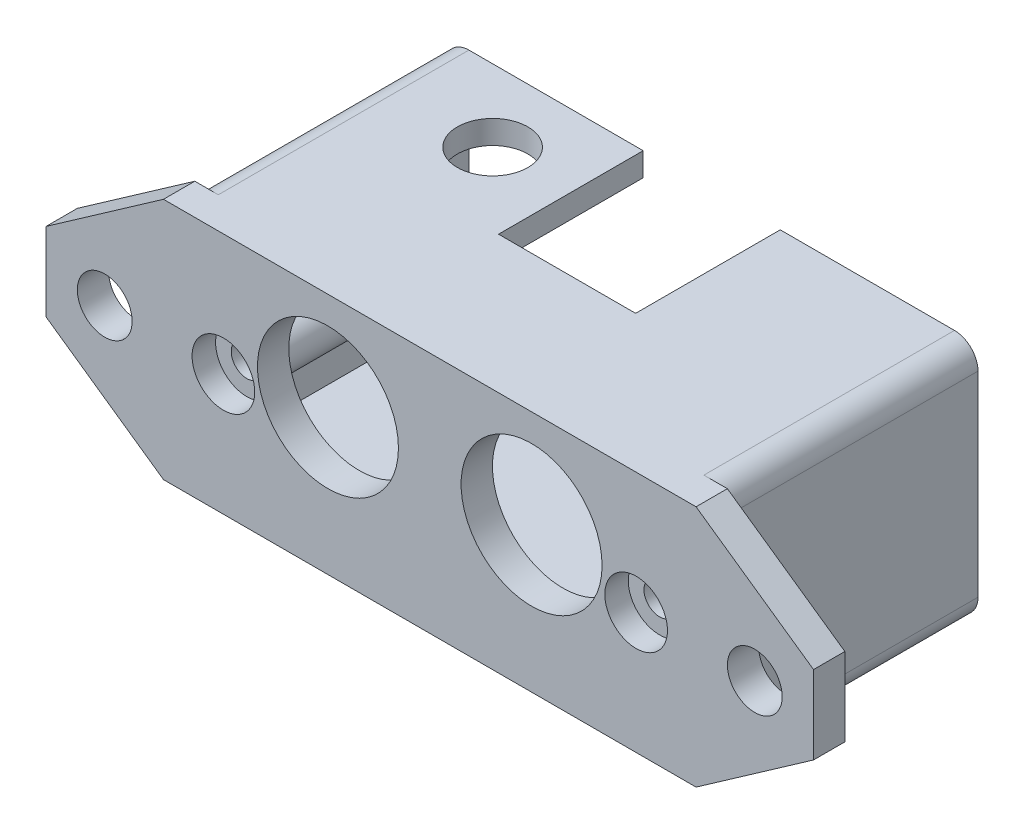
ISO-10303-21;
HEADER;
FILE_DESCRIPTION(('STEP AP214'),'2;1');
FILE_NAME('part.step','',(''),(''),'','','');
FILE_SCHEMA(('AUTOMOTIVE_DESIGN { 1 0 10303 214 1 1 1 1 }'));
ENDSEC;
DATA;
#1=APPLICATION_CONTEXT('core data for automotive mechanical design processes');
#2=APPLICATION_PROTOCOL_DEFINITION('international standard','automotive_design',2000,#1);
#3=PRODUCT_CONTEXT('',#1,'mechanical');
#4=PRODUCT('Part','Part','',(#3));
#5=PRODUCT_RELATED_PRODUCT_CATEGORY('part','',(#4));
#6=PRODUCT_DEFINITION_FORMATION('','',#4);
#7=PRODUCT_DEFINITION_CONTEXT('part definition',#1,'design');
#8=PRODUCT_DEFINITION('design','',#6,#7);
#9=PRODUCT_DEFINITION_SHAPE('','',#8);
#10=(LENGTH_UNIT() NAMED_UNIT(*) SI_UNIT(.MILLI.,.METRE.));
#11=(NAMED_UNIT(*) PLANE_ANGLE_UNIT() SI_UNIT($,.RADIAN.));
#12=(NAMED_UNIT(*) SI_UNIT($,.STERADIAN.) SOLID_ANGLE_UNIT());
#13=UNCERTAINTY_MEASURE_WITH_UNIT(LENGTH_MEASURE(1.E-05),#10,'distance_accuracy_value','');
#14=(GEOMETRIC_REPRESENTATION_CONTEXT(3) GLOBAL_UNCERTAINTY_ASSIGNED_CONTEXT((#13)) GLOBAL_UNIT_ASSIGNED_CONTEXT((#10,
#11,#12)) REPRESENTATION_CONTEXT('',''));
#15=CARTESIAN_POINT('',(0.,0.,0.));
#16=DIRECTION('',(0.,0.,1.));
#17=DIRECTION('',(1.,0.,0.));
#18=AXIS2_PLACEMENT_3D('',#15,#16,#17);
#19=CARTESIAN_POINT('',(-26.35,0.,4.));
#20=DIRECTION('',(0.,0.,-1.));
#21=DIRECTION('',(-1.,0.,0.));
#22=AXIS2_PLACEMENT_3D('',#19,#20,#21);
#23=CYLINDRICAL_SURFACE('',#22,2.);
#24=CARTESIAN_POINT('',(-26.35,0.,-12.));
#25=DIRECTION('',(0.,0.,1.));
#26=DIRECTION('',(1.,0.,0.));
#27=AXIS2_PLACEMENT_3D('',#24,#25,#26);
#28=CIRCLE('',#27,2.);
#29=CARTESIAN_POINT('',(-24.35,0.,-12.));
#30=VERTEX_POINT('',#29);
#31=EDGE_CURVE('E303',#30,#30,#28,.T.);
#32=ORIENTED_EDGE('',*,*,#31,.F.);
#33=EDGE_LOOP('',(#32));
#34=FACE_BOUND('',#33,.T.);
#35=CARTESIAN_POINT('',(-26.35,0.,1.));
#36=DIRECTION('',(0.,0.,1.));
#37=DIRECTION('',(1.,0.,0.));
#38=AXIS2_PLACEMENT_3D('',#35,#36,#37);
#39=CIRCLE('',#38,2.);
#40=CARTESIAN_POINT('',(-24.35,0.,1.));
#41=VERTEX_POINT('',#40);
#42=EDGE_CURVE('E946',#41,#41,#39,.T.);
#43=ORIENTED_EDGE('',*,*,#42,.T.);
#44=EDGE_LOOP('',(#43));
#45=FACE_BOUND('',#44,.T.);
#46=ADVANCED_FACE('F34',(#34,#45),#23,.F.);
#47=CARTESIAN_POINT('',(26.35,0.,4.));
#48=DIRECTION('',(0.,0.,-1.));
#49=DIRECTION('',(-1.,0.,0.));
#50=AXIS2_PLACEMENT_3D('',#47,#48,#49);
#51=CYLINDRICAL_SURFACE('',#50,2.);
#52=CARTESIAN_POINT('',(26.35,0.,-12.));
#53=DIRECTION('',(0.,0.,1.));
#54=DIRECTION('',(1.,0.,0.));
#55=AXIS2_PLACEMENT_3D('',#52,#53,#54);
#56=CIRCLE('',#55,2.);
#57=CARTESIAN_POINT('',(28.35,0.,-12.));
#58=VERTEX_POINT('',#57);
#59=EDGE_CURVE('E323',#58,#58,#56,.T.);
#60=ORIENTED_EDGE('',*,*,#59,.F.);
#61=EDGE_LOOP('',(#60));
#62=FACE_BOUND('',#61,.T.);
#63=CARTESIAN_POINT('',(26.35,0.,1.));
#64=DIRECTION('',(0.,0.,1.));
#65=DIRECTION('',(1.,0.,0.));
#66=AXIS2_PLACEMENT_3D('',#63,#64,#65);
#67=CIRCLE('',#66,2.);
#68=CARTESIAN_POINT('',(28.35,0.,1.));
#69=VERTEX_POINT('',#68);
#70=EDGE_CURVE('E937',#69,#69,#67,.T.);
#71=ORIENTED_EDGE('',*,*,#70,.T.);
#72=EDGE_LOOP('',(#71));
#73=FACE_BOUND('',#72,.T.);
#74=ADVANCED_FACE('F515',(#62,#73),#51,.F.);
#75=CARTESIAN_POINT('',(-34.,15.5,4.));
#76=DIRECTION('',(0.,-1.,0.));
#77=DIRECTION('',(1.,0.,0.));
#78=AXIS2_PLACEMENT_3D('',#75,#76,#77);
#79=PLANE('',#78);
#80=CARTESIAN_POINT('',(-18.75,15.5,-22.7736833205407));
#81=DIRECTION('',(0.,-1.,0.));
#82=DIRECTION('',(1.,0.,0.));
#83=AXIS2_PLACEMENT_3D('',#80,#81,#82);
#84=CIRCLE('',#83,4.5);
#85=CARTESIAN_POINT('',(-14.25,15.5,-22.7736833205407));
#86=VERTEX_POINT('',#85);
#87=EDGE_CURVE('E927',#86,#86,#84,.F.);
#88=ORIENTED_EDGE('',*,*,#87,.F.);
#89=EDGE_LOOP('',(#88));
#90=FACE_BOUND('',#89,.T.);
#91=DIRECTION('',(0.,0.,-1.));
#92=VECTOR('',#91,1.);
#93=CARTESIAN_POINT('',(8.75000000000001,15.5,3.99999999999999));
#94=LINE('',#93,#92);
#95=CARTESIAN_POINT('',(8.75,15.5,-13.5324195221433));
#96=VERTEX_POINT('',#95);
#97=CARTESIAN_POINT('',(8.75,15.5,-32.));
#98=VERTEX_POINT('',#97);
#99=EDGE_CURVE('E215',#96,#98,#94,.T.);
#100=ORIENTED_EDGE('',*,*,#99,.F.);
#101=DIRECTION('',(1.,0.,0.));
#102=VECTOR('',#101,1.);
#103=CARTESIAN_POINT('',(-34.,15.5,-13.5324195221433));
#104=LINE('',#103,#102);
#105=CARTESIAN_POINT('',(-8.75,15.5,-13.5324195221433));
#106=VERTEX_POINT('',#105);
#107=EDGE_CURVE('E208',#106,#96,#104,.T.);
#108=ORIENTED_EDGE('',*,*,#107,.F.);
#109=DIRECTION('',(0.,0.,1.));
#110=VECTOR('',#109,1.);
#111=CARTESIAN_POINT('',(-8.75,15.5,4.));
#112=LINE('',#111,#110);
#113=CARTESIAN_POINT('',(-8.75,15.5,-32.));
#114=VERTEX_POINT('',#113);
#115=EDGE_CURVE('E195',#114,#106,#112,.T.);
#116=ORIENTED_EDGE('',*,*,#115,.F.);
#117=DIRECTION('',(-1.,0.,0.));
#118=VECTOR('',#117,1.);
#119=CARTESIAN_POINT('',(31.,15.5,-32.));
#120=LINE('',#119,#118);
#121=CARTESIAN_POINT('',(-31.,15.5,-32.));
#122=VERTEX_POINT('',#121);
#123=EDGE_CURVE('E280',#114,#122,#120,.T.);
#124=ORIENTED_EDGE('',*,*,#123,.T.);
#125=DIRECTION('',(0.,0.,1.));
#126=VECTOR('',#125,1.);
#127=CARTESIAN_POINT('',(-31.,15.5,-32.));
#128=LINE('',#127,#126);
#129=CARTESIAN_POINT('',(-31.,15.5,0.));
#130=VERTEX_POINT('',#129);
#131=EDGE_CURVE('E300',#122,#130,#128,.T.);
#132=ORIENTED_EDGE('',*,*,#131,.T.);
#133=DIRECTION('',(-1.,0.,0.));
#134=VECTOR('',#133,1.);
#135=CARTESIAN_POINT('',(-34.,15.5,0.));
#136=LINE('',#135,#134);
#137=CARTESIAN_POINT('',(-34.,15.5,0.));
#138=VERTEX_POINT('',#137);
#139=EDGE_CURVE('E394',#130,#138,#136,.T.);
#140=ORIENTED_EDGE('',*,*,#139,.T.);
#141=DIRECTION('',(0.,0.,-1.));
#142=VECTOR('',#141,1.);
#143=CARTESIAN_POINT('',(-34.,15.5,4.));
#144=LINE('',#143,#142);
#145=CARTESIAN_POINT('',(-34.,15.5,4.));
#146=VERTEX_POINT('',#145);
#147=EDGE_CURVE('E377',#146,#138,#144,.T.);
#148=ORIENTED_EDGE('',*,*,#147,.F.);
#149=DIRECTION('',(-1.,0.,0.));
#150=VECTOR('',#149,1.);
#151=CARTESIAN_POINT('',(-34.,15.5,4.));
#152=LINE('',#151,#150);
#153=CARTESIAN_POINT('',(34.,15.5,4.));
#154=VERTEX_POINT('',#153);
#155=EDGE_CURVE('E375',#154,#146,#152,.T.);
#156=ORIENTED_EDGE('',*,*,#155,.F.);
#157=DIRECTION('',(0.,0.,-1.));
#158=VECTOR('',#157,1.);
#159=CARTESIAN_POINT('',(34.,15.5,4.));
#160=LINE('',#159,#158);
#161=CARTESIAN_POINT('',(34.,15.5,0.));
#162=VERTEX_POINT('',#161);
#163=EDGE_CURVE('E399',#154,#162,#160,.T.);
#164=ORIENTED_EDGE('',*,*,#163,.T.);
#165=CARTESIAN_POINT('',(31.,15.5,0.));
#166=VERTEX_POINT('',#165);
#167=EDGE_CURVE('E363',#162,#166,#136,.T.);
#168=ORIENTED_EDGE('',*,*,#167,.T.);
#169=DIRECTION('',(0.,0.,1.));
#170=VECTOR('',#169,1.);
#171=CARTESIAN_POINT('',(31.,15.5,-32.));
#172=LINE('',#171,#170);
#173=CARTESIAN_POINT('',(31.,15.5,-32.));
#174=VERTEX_POINT('',#173);
#175=EDGE_CURVE('E304',#174,#166,#172,.T.);
#176=ORIENTED_EDGE('',*,*,#175,.F.);
#177=EDGE_CURVE('E281',#174,#98,#120,.T.);
#178=ORIENTED_EDGE('',*,*,#177,.T.);
#179=EDGE_LOOP('',(#100,#108,#116,#124,#132,#140,#148,#156,#164,#168,#176,#178));
#180=FACE_BOUND('',#179,.T.);
#181=ADVANCED_FACE('F213',(#90,#180),#79,.F.);
#182=CARTESIAN_POINT('',(-31.,12.5,-32.));
#183=DIRECTION('',(0.,0.,-1.));
#184=DIRECTION('',(-1.,0.,0.));
#185=AXIS2_PLACEMENT_3D('',#182,#183,#184);
#186=PLANE('',#185);
#187=DIRECTION('',(-1.,0.,0.));
#188=VECTOR('',#187,1.);
#189=CARTESIAN_POINT('',(-31.,12.5,-32.));
#190=LINE('',#189,#188);
#191=CARTESIAN_POINT('',(31.,12.5,-32.));
#192=VERTEX_POINT('',#191);
#193=CARTESIAN_POINT('',(8.75,12.5,-32.));
#194=VERTEX_POINT('',#193);
#195=EDGE_CURVE('E223',#192,#194,#190,.T.);
#196=ORIENTED_EDGE('',*,*,#195,.T.);
#197=DIRECTION('',(0.,1.,0.));
#198=VECTOR('',#197,1.);
#199=CARTESIAN_POINT('',(8.75,12.5,-32.));
#200=LINE('',#199,#198);
#201=EDGE_CURVE('E205',#194,#98,#200,.T.);
#202=ORIENTED_EDGE('',*,*,#201,.T.);
#203=ORIENTED_EDGE('',*,*,#177,.F.);
#204=CARTESIAN_POINT('',(31.,12.5,-32.));
#205=DIRECTION('',(0.,0.,1.));
#206=DIRECTION('',(1.,0.,0.));
#207=AXIS2_PLACEMENT_3D('',#204,#205,#206);
#208=CIRCLE('',#207,3.);
#209=CARTESIAN_POINT('',(34.,12.5,-32.));
#210=VERTEX_POINT('',#209);
#211=EDGE_CURVE('E277',#210,#174,#208,.T.);
#212=ORIENTED_EDGE('',*,*,#211,.F.);
#213=DIRECTION('',(0.,1.,0.));
#214=VECTOR('',#213,1.);
#215=CARTESIAN_POINT('',(34.,12.5,-32.));
#216=LINE('',#215,#214);
#217=CARTESIAN_POINT('',(34.,-12.5,-32.));
#218=VERTEX_POINT('',#217);
#219=EDGE_CURVE('E274',#218,#210,#216,.T.);
#220=ORIENTED_EDGE('',*,*,#219,.F.);
#221=CARTESIAN_POINT('',(31.,-12.5,-32.));
#222=DIRECTION('',(0.,0.,1.));
#223=DIRECTION('',(1.,0.,0.));
#224=AXIS2_PLACEMENT_3D('',#221,#222,#223);
#225=CIRCLE('',#224,3.);
#226=CARTESIAN_POINT('',(31.,-15.5,-32.));
#227=VERTEX_POINT('',#226);
#228=EDGE_CURVE('E271',#227,#218,#225,.T.);
#229=ORIENTED_EDGE('',*,*,#228,.F.);
#230=DIRECTION('',(1.,0.,0.));
#231=VECTOR('',#230,1.);
#232=CARTESIAN_POINT('',(31.,-15.5,-32.));
#233=LINE('',#232,#231);
#234=CARTESIAN_POINT('',(-31.,-15.5,-32.));
#235=VERTEX_POINT('',#234);
#236=EDGE_CURVE('E268',#235,#227,#233,.T.);
#237=ORIENTED_EDGE('',*,*,#236,.F.);
#238=CARTESIAN_POINT('',(-31.,-12.5,-32.));
#239=DIRECTION('',(0.,0.,1.));
#240=DIRECTION('',(1.,0.,0.));
#241=AXIS2_PLACEMENT_3D('',#238,#239,#240);
#242=CIRCLE('',#241,3.);
#243=CARTESIAN_POINT('',(-34.,-12.5,-32.));
#244=VERTEX_POINT('',#243);
#245=EDGE_CURVE('E265',#244,#235,#242,.T.);
#246=ORIENTED_EDGE('',*,*,#245,.F.);
#247=DIRECTION('',(0.,-1.,0.));
#248=VECTOR('',#247,1.);
#249=CARTESIAN_POINT('',(-34.,12.5,-32.));
#250=LINE('',#249,#248);
#251=CARTESIAN_POINT('',(-34.,12.5,-32.));
#252=VERTEX_POINT('',#251);
#253=EDGE_CURVE('E261',#252,#244,#250,.T.);
#254=ORIENTED_EDGE('',*,*,#253,.F.);
#255=CARTESIAN_POINT('',(-31.,12.5,-32.));
#256=DIRECTION('',(0.,0.,1.));
#257=DIRECTION('',(-1.,0.,0.));
#258=AXIS2_PLACEMENT_3D('',#255,#256,#257);
#259=CIRCLE('',#258,3.);
#260=EDGE_CURVE('E258',#122,#252,#259,.T.);
#261=ORIENTED_EDGE('',*,*,#260,.F.);
#262=ORIENTED_EDGE('',*,*,#123,.F.);
#263=DIRECTION('',(0.,-1.,0.));
#264=VECTOR('',#263,1.);
#265=CARTESIAN_POINT('',(-8.75,12.5,-32.));
#266=LINE('',#265,#264);
#267=CARTESIAN_POINT('',(-8.75,12.5,-32.));
#268=VERTEX_POINT('',#267);
#269=EDGE_CURVE('E201',#114,#268,#266,.T.);
#270=ORIENTED_EDGE('',*,*,#269,.T.);
#271=CARTESIAN_POINT('',(-31.,12.5,-32.));
#272=VERTEX_POINT('',#271);
#273=EDGE_CURVE('E227',#268,#272,#190,.T.);
#274=ORIENTED_EDGE('',*,*,#273,.T.);
#275=DIRECTION('',(0.,-1.,0.));
#276=VECTOR('',#275,1.);
#277=CARTESIAN_POINT('',(-31.,12.5,-32.));
#278=LINE('',#277,#276);
#279=CARTESIAN_POINT('',(-31.,-12.5,-32.));
#280=VERTEX_POINT('',#279);
#281=EDGE_CURVE('E226',#272,#280,#278,.T.);
#282=ORIENTED_EDGE('',*,*,#281,.T.);
#283=DIRECTION('',(1.,0.,0.));
#284=VECTOR('',#283,1.);
#285=CARTESIAN_POINT('',(31.,-12.5,-32.));
#286=LINE('',#285,#284);
#287=CARTESIAN_POINT('',(31.,-12.5,-32.));
#288=VERTEX_POINT('',#287);
#289=EDGE_CURVE('E230',#280,#288,#286,.T.);
#290=ORIENTED_EDGE('',*,*,#289,.T.);
#291=DIRECTION('',(0.,1.,0.));
#292=VECTOR('',#291,1.);
#293=CARTESIAN_POINT('',(31.,12.5,-32.));
#294=LINE('',#293,#292);
#295=EDGE_CURVE('E233',#288,#192,#294,.T.);
#296=ORIENTED_EDGE('',*,*,#295,.T.);
#297=EDGE_LOOP('',(#196,#202,#203,#212,#220,#229,#237,#246,#254,#261,#262,#270,#274,#282,#290,#296));
#298=FACE_BOUND('',#297,.T.);
#299=ADVANCED_FACE('F424',(#298),#186,.T.);
#300=CARTESIAN_POINT('',(-31.,12.5,-32.));
#301=DIRECTION('',(0.,1.,0.));
#302=DIRECTION('',(0.,0.,1.));
#303=AXIS2_PLACEMENT_3D('',#300,#301,#302);
#304=PLANE('',#303);
#305=CARTESIAN_POINT('',(-18.75,12.5,-22.7736833205407));
#306=DIRECTION('',(0.,1.,0.));
#307=DIRECTION('',(0.,0.,1.));
#308=AXIS2_PLACEMENT_3D('',#305,#306,#307);
#309=CIRCLE('',#308,4.5);
#310=CARTESIAN_POINT('',(-18.75,12.5,-18.2736833205407));
#311=VERTEX_POINT('',#310);
#312=EDGE_CURVE('E38',#311,#311,#309,.F.);
#313=ORIENTED_EDGE('',*,*,#312,.F.);
#314=EDGE_LOOP('',(#313));
#315=FACE_BOUND('',#314,.T.);
#316=DIRECTION('',(0.,0.,1.));
#317=VECTOR('',#316,1.);
#318=CARTESIAN_POINT('',(8.75,12.5,-32.));
#319=LINE('',#318,#317);
#320=CARTESIAN_POINT('',(8.75,12.5,-13.5324195221433));
#321=VERTEX_POINT('',#320);
#322=EDGE_CURVE('E11',#194,#321,#319,.T.);
#323=ORIENTED_EDGE('',*,*,#322,.F.);
#324=ORIENTED_EDGE('',*,*,#195,.F.);
#325=DIRECTION('',(0.,0.,1.));
#326=VECTOR('',#325,1.);
#327=CARTESIAN_POINT('',(31.,12.5,-32.));
#328=LINE('',#327,#326);
#329=CARTESIAN_POINT('',(31.,12.5,0.));
#330=VERTEX_POINT('',#329);
#331=EDGE_CURVE('E247',#192,#330,#328,.T.);
#332=ORIENTED_EDGE('',*,*,#331,.T.);
#333=DIRECTION('',(-1.,0.,0.));
#334=VECTOR('',#333,1.);
#335=CARTESIAN_POINT('',(-31.,12.5,0.));
#336=LINE('',#335,#334);
#337=CARTESIAN_POINT('',(-31.,12.5,0.));
#338=VERTEX_POINT('',#337);
#339=EDGE_CURVE('E57',#330,#338,#336,.T.);
#340=ORIENTED_EDGE('',*,*,#339,.T.);
#341=DIRECTION('',(0.,0.,1.));
#342=VECTOR('',#341,1.);
#343=CARTESIAN_POINT('',(-31.,12.5,-32.));
#344=LINE('',#343,#342);
#345=EDGE_CURVE('E236',#272,#338,#344,.T.);
#346=ORIENTED_EDGE('',*,*,#345,.F.);
#347=ORIENTED_EDGE('',*,*,#273,.F.);
#348=DIRECTION('',(0.,0.,-1.));
#349=VECTOR('',#348,1.);
#350=CARTESIAN_POINT('',(-8.75,12.5,-32.));
#351=LINE('',#350,#349);
#352=CARTESIAN_POINT('',(-8.75,12.5,-13.5324195221433));
#353=VERTEX_POINT('',#352);
#354=EDGE_CURVE('E43',#353,#268,#351,.T.);
#355=ORIENTED_EDGE('',*,*,#354,.F.);
#356=DIRECTION('',(-1.,0.,0.));
#357=VECTOR('',#356,1.);
#358=CARTESIAN_POINT('',(-31.,12.5,-13.5324195221433));
#359=LINE('',#358,#357);
#360=EDGE_CURVE('E210',#321,#353,#359,.T.);
#361=ORIENTED_EDGE('',*,*,#360,.F.);
#362=EDGE_LOOP('',(#323,#324,#332,#340,#346,#347,#355,#361));
#363=FACE_BOUND('',#362,.T.);
#364=ADVANCED_FACE('F428',(#315,#363),#304,.F.);
#365=CARTESIAN_POINT('',(0.,0.,0.));
#366=DIRECTION('',(0.,0.,1.));
#367=DIRECTION('',(1.,0.,0.));
#368=AXIS2_PLACEMENT_3D('',#365,#366,#367);
#369=PLANE('',#368);
#370=CARTESIAN_POINT('',(41.5,0.,0.));
#371=DIRECTION('',(0.,0.,1.));
#372=DIRECTION('',(1.,0.,0.));
#373=AXIS2_PLACEMENT_3D('',#370,#371,#372);
#374=CIRCLE('',#373,3.5);
#375=CARTESIAN_POINT('',(45.,0.,0.));
#376=VERTEX_POINT('',#375);
#377=EDGE_CURVE('E338',#376,#376,#374,.T.);
#378=ORIENTED_EDGE('',*,*,#377,.T.);
#379=EDGE_LOOP('',(#378));
#380=FACE_BOUND('',#379,.T.);
#381=DIRECTION('',(0.,1.,0.));
#382=VECTOR('',#381,1.);
#383=CARTESIAN_POINT('',(34.,12.5,0.));
#384=LINE('',#383,#382);
#385=CARTESIAN_POINT('',(34.,-12.5,0.));
#386=VERTEX_POINT('',#385);
#387=CARTESIAN_POINT('',(34.,12.5,0.));
#388=VERTEX_POINT('',#387);
#389=EDGE_CURVE('E295',#386,#388,#384,.T.);
#390=ORIENTED_EDGE('',*,*,#389,.T.);
#391=CARTESIAN_POINT('',(31.,12.5,0.));
#392=DIRECTION('',(0.,0.,1.));
#393=DIRECTION('',(1.,0.,0.));
#394=AXIS2_PLACEMENT_3D('',#391,#392,#393);
#395=CIRCLE('',#394,3.);
#396=EDGE_CURVE('E262',#388,#166,#395,.T.);
#397=ORIENTED_EDGE('',*,*,#396,.T.);
#398=ORIENTED_EDGE('',*,*,#167,.F.);
#399=DIRECTION('',(-0.819231920519041,0.573462344363328,0.));
#400=VECTOR('',#399,1.);
#401=CARTESIAN_POINT('',(49.,5.,0.));
#402=LINE('',#401,#400);
#403=CARTESIAN_POINT('',(49.,5.,0.));
#404=VERTEX_POINT('',#403);
#405=EDGE_CURVE('E392',#404,#162,#402,.T.);
#406=ORIENTED_EDGE('',*,*,#405,.F.);
#407=DIRECTION('',(0.,1.,0.));
#408=VECTOR('',#407,1.);
#409=CARTESIAN_POINT('',(49.,5.,0.));
#410=LINE('',#409,#408);
#411=CARTESIAN_POINT('',(49.,-5.,0.));
#412=VERTEX_POINT('',#411);
#413=EDGE_CURVE('E390',#412,#404,#410,.T.);
#414=ORIENTED_EDGE('',*,*,#413,.F.);
#415=DIRECTION('',(0.819231920519041,0.573462344363328,0.));
#416=VECTOR('',#415,1.);
#417=CARTESIAN_POINT('',(49.,-5.,0.));
#418=LINE('',#417,#416);
#419=CARTESIAN_POINT('',(34.,-15.5,0.));
#420=VERTEX_POINT('',#419);
#421=EDGE_CURVE('E388',#420,#412,#418,.T.);
#422=ORIENTED_EDGE('',*,*,#421,.F.);
#423=DIRECTION('',(1.,0.,0.));
#424=VECTOR('',#423,1.);
#425=CARTESIAN_POINT('',(-34.,-15.5,0.));
#426=LINE('',#425,#424);
#427=CARTESIAN_POINT('',(31.,-15.5,0.));
#428=VERTEX_POINT('',#427);
#429=EDGE_CURVE('E384',#428,#420,#426,.T.);
#430=ORIENTED_EDGE('',*,*,#429,.F.);
#431=CARTESIAN_POINT('',(31.,-12.5,0.));
#432=DIRECTION('',(0.,0.,1.));
#433=DIRECTION('',(1.,0.,0.));
#434=AXIS2_PLACEMENT_3D('',#431,#432,#433);
#435=CIRCLE('',#434,3.);
#436=EDGE_CURVE('E292',#428,#386,#435,.T.);
#437=ORIENTED_EDGE('',*,*,#436,.T.);
#438=EDGE_LOOP('',(#390,#397,#398,#406,#414,#422,#430,#437));
#439=FACE_BOUND('',#438,.T.);
#440=ADVANCED_FACE('F493',(#380,#439),#369,.F.);
#441=CARTESIAN_POINT('',(13.,3.,0.));
#442=DIRECTION('',(0.,0.,1.));
#443=DIRECTION('',(1.,0.,0.));
#444=AXIS2_PLACEMENT_3D('',#441,#442,#443);
#445=CIRCLE('',#444,9.);
#446=CARTESIAN_POINT('',(22.,3.,0.));
#447=VERTEX_POINT('',#446);
#448=EDGE_CURVE('E332',#447,#447,#445,.T.);
#449=ORIENTED_EDGE('',*,*,#448,.T.);
#450=EDGE_LOOP('',(#449));
#451=FACE_BOUND('',#450,.T.);
#452=CARTESIAN_POINT('',(-13.,3.,0.));
#453=DIRECTION('',(0.,0.,1.));
#454=DIRECTION('',(1.,0.,0.));
#455=AXIS2_PLACEMENT_3D('',#452,#453,#454);
#456=CIRCLE('',#455,9.);
#457=CARTESIAN_POINT('',(-4.,3.,0.));
#458=VERTEX_POINT('',#457);
#459=EDGE_CURVE('E350',#458,#458,#456,.T.);
#460=ORIENTED_EDGE('',*,*,#459,.T.);
#461=EDGE_LOOP('',(#460));
#462=FACE_BOUND('',#461,.T.);
#463=CARTESIAN_POINT('',(26.35,0.,0.));
#464=DIRECTION('',(0.,0.,1.));
#465=DIRECTION('',(1.,0.,0.));
#466=AXIS2_PLACEMENT_3D('',#463,#464,#465);
#467=CIRCLE('',#466,3.);
#468=CARTESIAN_POINT('',(29.35,0.,0.));
#469=VERTEX_POINT('',#468);
#470=EDGE_CURVE('E328',#469,#469,#467,.T.);
#471=ORIENTED_EDGE('',*,*,#470,.T.);
#472=EDGE_LOOP('',(#471));
#473=FACE_BOUND('',#472,.T.);
#474=CARTESIAN_POINT('',(-26.35,0.,0.));
#475=DIRECTION('',(0.,0.,1.));
#476=DIRECTION('',(1.,0.,0.));
#477=AXIS2_PLACEMENT_3D('',#474,#475,#476);
#478=CIRCLE('',#477,3.);
#479=CARTESIAN_POINT('',(-23.35,0.,0.));
#480=VERTEX_POINT('',#479);
#481=EDGE_CURVE('E319',#480,#480,#478,.T.);
#482=ORIENTED_EDGE('',*,*,#481,.T.);
#483=EDGE_LOOP('',(#482));
#484=FACE_BOUND('',#483,.T.);
#485=ORIENTED_EDGE('',*,*,#339,.F.);
#486=DIRECTION('',(0.,1.,0.));
#487=VECTOR('',#486,1.);
#488=CARTESIAN_POINT('',(31.,12.5,0.));
#489=LINE('',#488,#487);
#490=CARTESIAN_POINT('',(31.,-12.5,0.));
#491=VERTEX_POINT('',#490);
#492=EDGE_CURVE('E244',#491,#330,#489,.T.);
#493=ORIENTED_EDGE('',*,*,#492,.F.);
#494=DIRECTION('',(1.,0.,0.));
#495=VECTOR('',#494,1.);
#496=CARTESIAN_POINT('',(31.,-12.5,0.));
#497=LINE('',#496,#495);
#498=CARTESIAN_POINT('',(-31.,-12.5,0.));
#499=VERTEX_POINT('',#498);
#500=EDGE_CURVE('E241',#499,#491,#497,.T.);
#501=ORIENTED_EDGE('',*,*,#500,.F.);
#502=DIRECTION('',(0.,-1.,0.));
#503=VECTOR('',#502,1.);
#504=CARTESIAN_POINT('',(-31.,12.5,0.));
#505=LINE('',#504,#503);
#506=EDGE_CURVE('E238',#338,#499,#505,.T.);
#507=ORIENTED_EDGE('',*,*,#506,.F.);
#508=EDGE_LOOP('',(#485,#493,#501,#507));
#509=FACE_BOUND('',#508,.T.);
#510=ADVANCED_FACE('F538',(#451,#462,#473,#484,#509),#369,.F.);
#511=CARTESIAN_POINT('',(0.,0.,4.));
#512=DIRECTION('',(0.,0.,1.));
#513=DIRECTION('',(1.,0.,0.));
#514=AXIS2_PLACEMENT_3D('',#511,#512,#513);
#515=PLANE('',#514);
#516=CARTESIAN_POINT('',(-26.35,0.,4.));
#517=DIRECTION('',(0.,0.,1.));
#518=DIRECTION('',(1.,0.,0.));
#519=AXIS2_PLACEMENT_3D('',#516,#517,#518);
#520=CIRCLE('',#519,4.);
#521=CARTESIAN_POINT('',(-22.35,0.,4.));
#522=VERTEX_POINT('',#521);
#523=EDGE_CURVE('E943',#522,#522,#520,.T.);
#524=ORIENTED_EDGE('',*,*,#523,.F.);
#525=EDGE_LOOP('',(#524));
#526=FACE_BOUND('',#525,.T.);
#527=CARTESIAN_POINT('',(26.35,0.,4.));
#528=DIRECTION('',(0.,0.,1.));
#529=DIRECTION('',(1.,0.,0.));
#530=AXIS2_PLACEMENT_3D('',#527,#528,#529);
#531=CIRCLE('',#530,4.);
#532=CARTESIAN_POINT('',(30.35,0.,4.));
#533=VERTEX_POINT('',#532);
#534=EDGE_CURVE('E932',#533,#533,#531,.T.);
#535=ORIENTED_EDGE('',*,*,#534,.F.);
#536=EDGE_LOOP('',(#535));
#537=FACE_BOUND('',#536,.T.);
#538=CARTESIAN_POINT('',(-13.,3.,4.));
#539=DIRECTION('',(0.,0.,1.));
#540=DIRECTION('',(1.,0.,0.));
#541=AXIS2_PLACEMENT_3D('',#538,#539,#540);
#542=CIRCLE('',#541,9.);
#543=CARTESIAN_POINT('',(-4.,3.,4.));
#544=VERTEX_POINT('',#543);
#545=EDGE_CURVE('E353',#544,#544,#542,.T.);
#546=ORIENTED_EDGE('',*,*,#545,.F.);
#547=EDGE_LOOP('',(#546));
#548=FACE_BOUND('',#547,.T.);
#549=DIRECTION('',(-0.819231920519039,-0.57346234436333,0.));
#550=VECTOR('',#549,1.);
#551=CARTESIAN_POINT('',(-49.,5.,4.));
#552=LINE('',#551,#550);
#553=CARTESIAN_POINT('',(-49.,5.,4.));
#554=VERTEX_POINT('',#553);
#555=EDGE_CURVE('E359',#146,#554,#552,.T.);
#556=ORIENTED_EDGE('',*,*,#555,.T.);
#557=DIRECTION('',(0.,-1.,0.));
#558=VECTOR('',#557,1.);
#559=CARTESIAN_POINT('',(-49.,5.,4.));
#560=LINE('',#559,#558);
#561=CARTESIAN_POINT('',(-49.,-5.,4.));
#562=VERTEX_POINT('',#561);
#563=EDGE_CURVE('E362',#554,#562,#560,.T.);
#564=ORIENTED_EDGE('',*,*,#563,.T.);
#565=DIRECTION('',(0.81923192051904,-0.573462344363328,0.));
#566=VECTOR('',#565,1.);
#567=CARTESIAN_POINT('',(-49.,-5.,4.));
#568=LINE('',#567,#566);
#569=CARTESIAN_POINT('',(-34.,-15.5,4.));
#570=VERTEX_POINT('',#569);
#571=EDGE_CURVE('E365',#562,#570,#568,.T.);
#572=ORIENTED_EDGE('',*,*,#571,.T.);
#573=DIRECTION('',(1.,0.,0.));
#574=VECTOR('',#573,1.);
#575=CARTESIAN_POINT('',(-34.,-15.5,4.));
#576=LINE('',#575,#574);
#577=CARTESIAN_POINT('',(34.,-15.5,4.));
#578=VERTEX_POINT('',#577);
#579=EDGE_CURVE('E367',#570,#578,#576,.T.);
#580=ORIENTED_EDGE('',*,*,#579,.T.);
#581=DIRECTION('',(0.819231920519041,0.573462344363328,0.));
#582=VECTOR('',#581,1.);
#583=CARTESIAN_POINT('',(49.,-5.,4.));
#584=LINE('',#583,#582);
#585=CARTESIAN_POINT('',(49.,-5.,4.));
#586=VERTEX_POINT('',#585);
#587=EDGE_CURVE('E369',#578,#586,#584,.T.);
#588=ORIENTED_EDGE('',*,*,#587,.T.);
#589=DIRECTION('',(0.,1.,0.));
#590=VECTOR('',#589,1.);
#591=CARTESIAN_POINT('',(49.,5.,4.));
#592=LINE('',#591,#590);
#593=CARTESIAN_POINT('',(49.,5.,4.));
#594=VERTEX_POINT('',#593);
#595=EDGE_CURVE('E371',#586,#594,#592,.T.);
#596=ORIENTED_EDGE('',*,*,#595,.T.);
#597=DIRECTION('',(-0.819231920519041,0.573462344363328,0.));
#598=VECTOR('',#597,1.);
#599=CARTESIAN_POINT('',(49.,5.,4.));
#600=LINE('',#599,#598);
#601=EDGE_CURVE('E373',#594,#154,#600,.T.);
#602=ORIENTED_EDGE('',*,*,#601,.T.);
#603=ORIENTED_EDGE('',*,*,#155,.T.);
#604=EDGE_LOOP('',(#556,#564,#572,#580,#588,#596,#602,#603));
#605=FACE_BOUND('',#604,.T.);
#606=CARTESIAN_POINT('',(-41.5,0.,4.));
#607=DIRECTION('',(0.,0.,1.));
#608=DIRECTION('',(1.,0.,0.));
#609=AXIS2_PLACEMENT_3D('',#606,#607,#608);
#610=CIRCLE('',#609,3.5);
#611=CARTESIAN_POINT('',(-38.,0.,4.));
#612=VERTEX_POINT('',#611);
#613=EDGE_CURVE('E347',#612,#612,#610,.T.);
#614=ORIENTED_EDGE('',*,*,#613,.F.);
#615=EDGE_LOOP('',(#614));
#616=FACE_BOUND('',#615,.T.);
#617=CARTESIAN_POINT('',(41.5,0.,4.));
#618=DIRECTION('',(0.,0.,1.));
#619=DIRECTION('',(1.,0.,0.));
#620=AXIS2_PLACEMENT_3D('',#617,#618,#619);
#621=CIRCLE('',#620,3.5);
#622=CARTESIAN_POINT('',(45.,0.,4.));
#623=VERTEX_POINT('',#622);
#624=EDGE_CURVE('E341',#623,#623,#621,.T.);
#625=ORIENTED_EDGE('',*,*,#624,.F.);
#626=EDGE_LOOP('',(#625));
#627=FACE_BOUND('',#626,.T.);
#628=CARTESIAN_POINT('',(13.,3.,4.));
#629=DIRECTION('',(0.,0.,1.));
#630=DIRECTION('',(1.,0.,0.));
#631=AXIS2_PLACEMENT_3D('',#628,#629,#630);
#632=CIRCLE('',#631,9.);
#633=CARTESIAN_POINT('',(22.,3.,4.));
#634=VERTEX_POINT('',#633);
#635=EDGE_CURVE('E335',#634,#634,#632,.T.);
#636=ORIENTED_EDGE('',*,*,#635,.F.);
#637=EDGE_LOOP('',(#636));
#638=FACE_BOUND('',#637,.T.);
#639=ADVANCED_FACE('F483',(#526,#537,#548,#605,#616,#627,#638),#515,.T.);
#640=ORIENTED_EDGE('',*,*,#139,.F.);
#641=CARTESIAN_POINT('',(-31.,12.5,0.));
#642=DIRECTION('',(0.,0.,1.));
#643=DIRECTION('',(-1.,0.,0.));
#644=AXIS2_PLACEMENT_3D('',#641,#642,#643);
#645=CIRCLE('',#644,3.);
#646=CARTESIAN_POINT('',(-34.,12.5,0.));
#647=VERTEX_POINT('',#646);
#648=EDGE_CURVE('E249',#130,#647,#645,.T.);
#649=ORIENTED_EDGE('',*,*,#648,.T.);
#650=DIRECTION('',(0.,-1.,0.));
#651=VECTOR('',#650,1.);
#652=CARTESIAN_POINT('',(-34.,12.5,0.));
#653=LINE('',#652,#651);
#654=CARTESIAN_POINT('',(-34.,-12.5,0.));
#655=VERTEX_POINT('',#654);
#656=EDGE_CURVE('E286',#647,#655,#653,.T.);
#657=ORIENTED_EDGE('',*,*,#656,.T.);
#658=CARTESIAN_POINT('',(-31.,-12.5,0.));
#659=DIRECTION('',(0.,0.,1.));
#660=DIRECTION('',(1.,0.,0.));
#661=AXIS2_PLACEMENT_3D('',#658,#659,#660);
#662=CIRCLE('',#661,3.);
#663=CARTESIAN_POINT('',(-31.,-15.5,0.));
#664=VERTEX_POINT('',#663);
#665=EDGE_CURVE('E289',#655,#664,#662,.T.);
#666=ORIENTED_EDGE('',*,*,#665,.T.);
#667=CARTESIAN_POINT('',(-34.,-15.5,0.));
#668=VERTEX_POINT('',#667);
#669=EDGE_CURVE('E385',#668,#664,#426,.T.);
#670=ORIENTED_EDGE('',*,*,#669,.F.);
#671=DIRECTION('',(0.81923192051904,-0.573462344363328,0.));
#672=VECTOR('',#671,1.);
#673=CARTESIAN_POINT('',(-49.,-5.,0.));
#674=LINE('',#673,#672);
#675=CARTESIAN_POINT('',(-49.,-5.,0.));
#676=VERTEX_POINT('',#675);
#677=EDGE_CURVE('E382',#676,#668,#674,.T.);
#678=ORIENTED_EDGE('',*,*,#677,.F.);
#679=DIRECTION('',(0.,-1.,0.));
#680=VECTOR('',#679,1.);
#681=CARTESIAN_POINT('',(-49.,5.,0.));
#682=LINE('',#681,#680);
#683=CARTESIAN_POINT('',(-49.,5.,0.));
#684=VERTEX_POINT('',#683);
#685=EDGE_CURVE('E380',#684,#676,#682,.T.);
#686=ORIENTED_EDGE('',*,*,#685,.F.);
#687=DIRECTION('',(-0.819231920519039,-0.57346234436333,0.));
#688=VECTOR('',#687,1.);
#689=CARTESIAN_POINT('',(-49.,5.,0.));
#690=LINE('',#689,#688);
#691=EDGE_CURVE('E356',#138,#684,#690,.T.);
#692=ORIENTED_EDGE('',*,*,#691,.F.);
#693=EDGE_LOOP('',(#640,#649,#657,#666,#670,#678,#686,#692));
#694=FACE_BOUND('',#693,.T.);
#695=CARTESIAN_POINT('',(-41.5,0.,0.));
#696=DIRECTION('',(0.,0.,1.));
#697=DIRECTION('',(1.,0.,0.));
#698=AXIS2_PLACEMENT_3D('',#695,#696,#697);
#699=CIRCLE('',#698,3.5);
#700=CARTESIAN_POINT('',(-38.,0.,0.));
#701=VERTEX_POINT('',#700);
#702=EDGE_CURVE('E344',#701,#701,#699,.T.);
#703=ORIENTED_EDGE('',*,*,#702,.T.);
#704=EDGE_LOOP('',(#703));
#705=FACE_BOUND('',#704,.T.);
#706=ADVANCED_FACE('F465',(#694,#705),#369,.F.);
#707=CARTESIAN_POINT('',(-49.,5.,4.));
#708=DIRECTION('',(0.57346234436333,-0.819231920519039,0.));
#709=DIRECTION('',(0.819231920519039,0.57346234436333,0.));
#710=AXIS2_PLACEMENT_3D('',#707,#708,#709);
#711=PLANE('',#710);
#712=ORIENTED_EDGE('',*,*,#691,.T.);
#713=DIRECTION('',(0.,0.,-1.));
#714=VECTOR('',#713,1.);
#715=CARTESIAN_POINT('',(-49.,5.,4.));
#716=LINE('',#715,#714);
#717=EDGE_CURVE('E417',#554,#684,#716,.T.);
#718=ORIENTED_EDGE('',*,*,#717,.F.);
#719=ORIENTED_EDGE('',*,*,#555,.F.);
#720=ORIENTED_EDGE('',*,*,#147,.T.);
#721=EDGE_LOOP('',(#712,#718,#719,#720));
#722=FACE_BOUND('',#721,.T.);
#723=ADVANCED_FACE('F36',(#722),#711,.F.);
#724=CARTESIAN_POINT('',(-49.,5.,4.));
#725=DIRECTION('',(1.,0.,0.));
#726=DIRECTION('',(0.,1.,0.));
#727=AXIS2_PLACEMENT_3D('',#724,#725,#726);
#728=PLANE('',#727);
#729=ORIENTED_EDGE('',*,*,#685,.T.);
#730=DIRECTION('',(0.,0.,-1.));
#731=VECTOR('',#730,1.);
#732=CARTESIAN_POINT('',(-49.,-5.,4.));
#733=LINE('',#732,#731);
#734=EDGE_CURVE('E414',#562,#676,#733,.T.);
#735=ORIENTED_EDGE('',*,*,#734,.F.);
#736=ORIENTED_EDGE('',*,*,#563,.F.);
#737=ORIENTED_EDGE('',*,*,#717,.T.);
#738=EDGE_LOOP('',(#729,#735,#736,#737));
#739=FACE_BOUND('',#738,.T.);
#740=ADVANCED_FACE('F507',(#739),#728,.F.);
#741=CARTESIAN_POINT('',(-49.,-5.,4.));
#742=DIRECTION('',(0.573462344363328,0.819231920519041,0.));
#743=DIRECTION('',(-0.81923192051904,0.573462344363328,0.));
#744=AXIS2_PLACEMENT_3D('',#741,#742,#743);
#745=PLANE('',#744);
#746=ORIENTED_EDGE('',*,*,#677,.T.);
#747=DIRECTION('',(0.,0.,-1.));
#748=VECTOR('',#747,1.);
#749=CARTESIAN_POINT('',(-34.,-15.5,4.));
#750=LINE('',#749,#748);
#751=EDGE_CURVE('E411',#570,#668,#750,.T.);
#752=ORIENTED_EDGE('',*,*,#751,.F.);
#753=ORIENTED_EDGE('',*,*,#571,.F.);
#754=ORIENTED_EDGE('',*,*,#734,.T.);
#755=EDGE_LOOP('',(#746,#752,#753,#754));
#756=FACE_BOUND('',#755,.T.);
#757=ADVANCED_FACE('F504',(#756),#745,.F.);
#758=CARTESIAN_POINT('',(-34.,-15.5,4.));
#759=DIRECTION('',(0.,1.,0.));
#760=DIRECTION('',(0.,0.,1.));
#761=AXIS2_PLACEMENT_3D('',#758,#759,#760);
#762=PLANE('',#761);
#763=ORIENTED_EDGE('',*,*,#669,.T.);
#764=DIRECTION('',(0.,0.,1.));
#765=VECTOR('',#764,1.);
#766=CARTESIAN_POINT('',(-31.,-15.5,-32.));
#767=LINE('',#766,#765);
#768=EDGE_CURVE('E312',#235,#664,#767,.T.);
#769=ORIENTED_EDGE('',*,*,#768,.F.);
#770=ORIENTED_EDGE('',*,*,#236,.T.);
#771=DIRECTION('',(0.,0.,1.));
#772=VECTOR('',#771,1.);
#773=CARTESIAN_POINT('',(31.,-15.5,-32.));
#774=LINE('',#773,#772);
#775=EDGE_CURVE('E310',#227,#428,#774,.T.);
#776=ORIENTED_EDGE('',*,*,#775,.T.);
#777=ORIENTED_EDGE('',*,*,#429,.T.);
#778=DIRECTION('',(0.,0.,-1.));
#779=VECTOR('',#778,1.);
#780=CARTESIAN_POINT('',(34.,-15.5,4.));
#781=LINE('',#780,#779);
#782=EDGE_CURVE('E408',#578,#420,#781,.T.);
#783=ORIENTED_EDGE('',*,*,#782,.F.);
#784=ORIENTED_EDGE('',*,*,#579,.F.);
#785=ORIENTED_EDGE('',*,*,#751,.T.);
#786=EDGE_LOOP('',(#763,#769,#770,#776,#777,#783,#784,#785));
#787=FACE_BOUND('',#786,.T.);
#788=ADVANCED_FACE('F458',(#787),#762,.F.);
#789=CARTESIAN_POINT('',(49.,-5.,4.));
#790=DIRECTION('',(-0.573462344363328,0.819231920519041,0.));
#791=DIRECTION('',(-0.819231920519041,-0.573462344363328,0.));
#792=AXIS2_PLACEMENT_3D('',#789,#790,#791);
#793=PLANE('',#792);
#794=ORIENTED_EDGE('',*,*,#421,.T.);
#795=DIRECTION('',(0.,0.,-1.));
#796=VECTOR('',#795,1.);
#797=CARTESIAN_POINT('',(49.,-5.,4.));
#798=LINE('',#797,#796);
#799=EDGE_CURVE('E405',#586,#412,#798,.T.);
#800=ORIENTED_EDGE('',*,*,#799,.F.);
#801=ORIENTED_EDGE('',*,*,#587,.F.);
#802=ORIENTED_EDGE('',*,*,#782,.T.);
#803=EDGE_LOOP('',(#794,#800,#801,#802));
#804=FACE_BOUND('',#803,.T.);
#805=ADVANCED_FACE('F499',(#804),#793,.F.);
#806=CARTESIAN_POINT('',(49.,5.,4.));
#807=DIRECTION('',(-1.,0.,0.));
#808=DIRECTION('',(0.,-1.,0.));
#809=AXIS2_PLACEMENT_3D('',#806,#807,#808);
#810=PLANE('',#809);
#811=ORIENTED_EDGE('',*,*,#413,.T.);
#812=DIRECTION('',(0.,0.,-1.));
#813=VECTOR('',#812,1.);
#814=CARTESIAN_POINT('',(49.,5.,4.));
#815=LINE('',#814,#813);
#816=EDGE_CURVE('E402',#594,#404,#815,.T.);
#817=ORIENTED_EDGE('',*,*,#816,.F.);
#818=ORIENTED_EDGE('',*,*,#595,.F.);
#819=ORIENTED_EDGE('',*,*,#799,.T.);
#820=EDGE_LOOP('',(#811,#817,#818,#819));
#821=FACE_BOUND('',#820,.T.);
#822=ADVANCED_FACE('F547',(#821),#810,.F.);
#823=CARTESIAN_POINT('',(49.,5.,4.));
#824=DIRECTION('',(-0.573462344363328,-0.819231920519041,0.));
#825=DIRECTION('',(0.819231920519041,-0.573462344363328,0.));
#826=AXIS2_PLACEMENT_3D('',#823,#824,#825);
#827=PLANE('',#826);
#828=ORIENTED_EDGE('',*,*,#405,.T.);
#829=ORIENTED_EDGE('',*,*,#163,.F.);
#830=ORIENTED_EDGE('',*,*,#601,.F.);
#831=ORIENTED_EDGE('',*,*,#816,.T.);
#832=EDGE_LOOP('',(#828,#829,#830,#831));
#833=FACE_BOUND('',#832,.T.);
#834=ADVANCED_FACE('F489',(#833),#827,.F.);
#835=CARTESIAN_POINT('',(-13.,3.,4.));
#836=DIRECTION('',(0.,0.,-1.));
#837=DIRECTION('',(-1.,0.,0.));
#838=AXIS2_PLACEMENT_3D('',#835,#836,#837);
#839=CYLINDRICAL_SURFACE('',#838,9.);
#840=ORIENTED_EDGE('',*,*,#545,.T.);
#841=EDGE_LOOP('',(#840));
#842=FACE_BOUND('',#841,.T.);
#843=ORIENTED_EDGE('',*,*,#459,.F.);
#844=EDGE_LOOP('',(#843));
#845=FACE_BOUND('',#844,.T.);
#846=ADVANCED_FACE('F531',(#842,#845),#839,.F.);
#847=CARTESIAN_POINT('',(-41.5,0.,4.));
#848=DIRECTION('',(0.,0.,-1.));
#849=DIRECTION('',(-1.,0.,0.));
#850=AXIS2_PLACEMENT_3D('',#847,#848,#849);
#851=CYLINDRICAL_SURFACE('',#850,3.5);
#852=ORIENTED_EDGE('',*,*,#613,.T.);
#853=EDGE_LOOP('',(#852));
#854=FACE_BOUND('',#853,.T.);
#855=ORIENTED_EDGE('',*,*,#702,.F.);
#856=EDGE_LOOP('',(#855));
#857=FACE_BOUND('',#856,.T.);
#858=ADVANCED_FACE('F528',(#854,#857),#851,.F.);
#859=CARTESIAN_POINT('',(41.5,0.,4.));
#860=DIRECTION('',(0.,0.,-1.));
#861=DIRECTION('',(-1.,0.,0.));
#862=AXIS2_PLACEMENT_3D('',#859,#860,#861);
#863=CYLINDRICAL_SURFACE('',#862,3.5);
#864=ORIENTED_EDGE('',*,*,#624,.T.);
#865=EDGE_LOOP('',(#864));
#866=FACE_BOUND('',#865,.T.);
#867=ORIENTED_EDGE('',*,*,#377,.F.);
#868=EDGE_LOOP('',(#867));
#869=FACE_BOUND('',#868,.T.);
#870=ADVANCED_FACE('F527',(#866,#869),#863,.F.);
#871=CARTESIAN_POINT('',(13.,3.,4.));
#872=DIRECTION('',(0.,0.,-1.));
#873=DIRECTION('',(-1.,0.,0.));
#874=AXIS2_PLACEMENT_3D('',#871,#872,#873);
#875=CYLINDRICAL_SURFACE('',#874,9.);
#876=ORIENTED_EDGE('',*,*,#635,.T.);
#877=EDGE_LOOP('',(#876));
#878=FACE_BOUND('',#877,.T.);
#879=ORIENTED_EDGE('',*,*,#448,.F.);
#880=EDGE_LOOP('',(#879));
#881=FACE_BOUND('',#880,.T.);
#882=ADVANCED_FACE('F588',(#878,#881),#875,.F.);
#883=CARTESIAN_POINT('',(26.35,0.,-12.));
#884=DIRECTION('',(0.,0.,1.));
#885=DIRECTION('',(1.,0.,0.));
#886=AXIS2_PLACEMENT_3D('',#883,#884,#885);
#887=CYLINDRICAL_SURFACE('',#886,3.);
#888=CARTESIAN_POINT('',(26.35,0.,-12.));
#889=DIRECTION('',(0.,0.,1.));
#890=DIRECTION('',(1.,0.,0.));
#891=AXIS2_PLACEMENT_3D('',#888,#889,#890);
#892=CIRCLE('',#891,3.);
#893=CARTESIAN_POINT('',(29.35,0.,-12.));
#894=VERTEX_POINT('',#893);
#895=EDGE_CURVE('E329',#894,#894,#892,.T.);
#896=ORIENTED_EDGE('',*,*,#895,.T.);
#897=EDGE_LOOP('',(#896));
#898=FACE_BOUND('',#897,.T.);
#899=ORIENTED_EDGE('',*,*,#470,.F.);
#900=EDGE_LOOP('',(#899));
#901=FACE_BOUND('',#900,.T.);
#902=ADVANCED_FACE('F595',(#898,#901),#887,.T.);
#903=CARTESIAN_POINT('',(26.35,0.,-12.));
#904=DIRECTION('',(0.,0.,1.));
#905=DIRECTION('',(1.,0.,0.));
#906=AXIS2_PLACEMENT_3D('',#903,#904,#905);
#907=PLANE('',#906);
#908=ORIENTED_EDGE('',*,*,#59,.T.);
#909=EDGE_LOOP('',(#908));
#910=FACE_BOUND('',#909,.T.);
#911=ORIENTED_EDGE('',*,*,#895,.F.);
#912=EDGE_LOOP('',(#911));
#913=FACE_BOUND('',#912,.T.);
#914=ADVANCED_FACE('F603',(#910,#913),#907,.F.);
#915=CARTESIAN_POINT('',(-26.35,0.,-12.));
#916=DIRECTION('',(0.,0.,1.));
#917=DIRECTION('',(1.,0.,0.));
#918=AXIS2_PLACEMENT_3D('',#915,#916,#917);
#919=CYLINDRICAL_SURFACE('',#918,3.);
#920=CARTESIAN_POINT('',(-26.35,0.,-12.));
#921=DIRECTION('',(0.,0.,1.));
#922=DIRECTION('',(1.,0.,0.));
#923=AXIS2_PLACEMENT_3D('',#920,#921,#922);
#924=CIRCLE('',#923,3.);
#925=CARTESIAN_POINT('',(-23.35,0.,-12.));
#926=VERTEX_POINT('',#925);
#927=EDGE_CURVE('E320',#926,#926,#924,.T.);
#928=ORIENTED_EDGE('',*,*,#927,.T.);
#929=EDGE_LOOP('',(#928));
#930=FACE_BOUND('',#929,.T.);
#931=ORIENTED_EDGE('',*,*,#481,.F.);
#932=EDGE_LOOP('',(#931));
#933=FACE_BOUND('',#932,.T.);
#934=ADVANCED_FACE('F611',(#930,#933),#919,.T.);
#935=CARTESIAN_POINT('',(-26.35,0.,-12.));
#936=DIRECTION('',(0.,0.,1.));
#937=DIRECTION('',(1.,0.,0.));
#938=AXIS2_PLACEMENT_3D('',#935,#936,#937);
#939=PLANE('',#938);
#940=ORIENTED_EDGE('',*,*,#31,.T.);
#941=EDGE_LOOP('',(#940));
#942=FACE_BOUND('',#941,.T.);
#943=ORIENTED_EDGE('',*,*,#927,.F.);
#944=EDGE_LOOP('',(#943));
#945=FACE_BOUND('',#944,.T.);
#946=ADVANCED_FACE('F619',(#942,#945),#939,.F.);
#947=CARTESIAN_POINT('',(-31.,12.5,-32.));
#948=DIRECTION('',(0.,0.,1.));
#949=DIRECTION('',(1.,0.,0.));
#950=AXIS2_PLACEMENT_3D('',#947,#948,#949);
#951=CYLINDRICAL_SURFACE('',#950,3.);
#952=ORIENTED_EDGE('',*,*,#648,.F.);
#953=ORIENTED_EDGE('',*,*,#131,.F.);
#954=ORIENTED_EDGE('',*,*,#260,.T.);
#955=DIRECTION('',(0.,0.,1.));
#956=VECTOR('',#955,1.);
#957=CARTESIAN_POINT('',(-34.,12.5,-32.));
#958=LINE('',#957,#956);
#959=EDGE_CURVE('E283',#252,#647,#958,.T.);
#960=ORIENTED_EDGE('',*,*,#959,.T.);
#961=EDGE_LOOP('',(#952,#953,#954,#960));
#962=FACE_BOUND('',#961,.T.);
#963=ADVANCED_FACE('F474',(#962),#951,.T.);
#964=CARTESIAN_POINT('',(31.,12.5,-32.));
#965=DIRECTION('',(0.,0.,1.));
#966=DIRECTION('',(1.,0.,0.));
#967=AXIS2_PLACEMENT_3D('',#964,#965,#966);
#968=CYLINDRICAL_SURFACE('',#967,3.);
#969=ORIENTED_EDGE('',*,*,#396,.F.);
#970=DIRECTION('',(0.,0.,1.));
#971=VECTOR('',#970,1.);
#972=CARTESIAN_POINT('',(34.,12.5,-32.));
#973=LINE('',#972,#971);
#974=EDGE_CURVE('E306',#210,#388,#973,.T.);
#975=ORIENTED_EDGE('',*,*,#974,.F.);
#976=ORIENTED_EDGE('',*,*,#211,.T.);
#977=ORIENTED_EDGE('',*,*,#175,.T.);
#978=EDGE_LOOP('',(#969,#975,#976,#977));
#979=FACE_BOUND('',#978,.T.);
#980=ADVANCED_FACE('F445',(#979),#968,.T.);
#981=CARTESIAN_POINT('',(34.,12.5,-32.));
#982=DIRECTION('',(1.,0.,0.));
#983=DIRECTION('',(0.,0.,-1.));
#984=AXIS2_PLACEMENT_3D('',#981,#982,#983);
#985=PLANE('',#984);
#986=ORIENTED_EDGE('',*,*,#389,.F.);
#987=DIRECTION('',(0.,0.,1.));
#988=VECTOR('',#987,1.);
#989=CARTESIAN_POINT('',(34.,-12.5,-32.));
#990=LINE('',#989,#988);
#991=EDGE_CURVE('E308',#218,#386,#990,.T.);
#992=ORIENTED_EDGE('',*,*,#991,.F.);
#993=ORIENTED_EDGE('',*,*,#219,.T.);
#994=ORIENTED_EDGE('',*,*,#974,.T.);
#995=EDGE_LOOP('',(#986,#992,#993,#994));
#996=FACE_BOUND('',#995,.T.);
#997=ADVANCED_FACE('F450',(#996),#985,.T.);
#998=CARTESIAN_POINT('',(31.,-12.5,-32.));
#999=DIRECTION('',(0.,0.,1.));
#1000=DIRECTION('',(1.,0.,0.));
#1001=AXIS2_PLACEMENT_3D('',#998,#999,#1000);
#1002=CYLINDRICAL_SURFACE('',#1001,3.);
#1003=ORIENTED_EDGE('',*,*,#436,.F.);
#1004=ORIENTED_EDGE('',*,*,#775,.F.);
#1005=ORIENTED_EDGE('',*,*,#228,.T.);
#1006=ORIENTED_EDGE('',*,*,#991,.T.);
#1007=EDGE_LOOP('',(#1003,#1004,#1005,#1006));
#1008=FACE_BOUND('',#1007,.T.);
#1009=ADVANCED_FACE('F453',(#1008),#1002,.T.);
#1010=CARTESIAN_POINT('',(-31.,-12.5,-32.));
#1011=DIRECTION('',(0.,0.,1.));
#1012=DIRECTION('',(1.,0.,0.));
#1013=AXIS2_PLACEMENT_3D('',#1010,#1011,#1012);
#1014=CYLINDRICAL_SURFACE('',#1013,3.);
#1015=ORIENTED_EDGE('',*,*,#665,.F.);
#1016=DIRECTION('',(0.,0.,1.));
#1017=VECTOR('',#1016,1.);
#1018=CARTESIAN_POINT('',(-34.,-12.5,-32.));
#1019=LINE('',#1018,#1017);
#1020=EDGE_CURVE('E314',#244,#655,#1019,.T.);
#1021=ORIENTED_EDGE('',*,*,#1020,.F.);
#1022=ORIENTED_EDGE('',*,*,#245,.T.);
#1023=ORIENTED_EDGE('',*,*,#768,.T.);
#1024=EDGE_LOOP('',(#1015,#1021,#1022,#1023));
#1025=FACE_BOUND('',#1024,.T.);
#1026=ADVANCED_FACE('F462',(#1025),#1014,.T.);
#1027=CARTESIAN_POINT('',(-34.,12.5,-32.));
#1028=DIRECTION('',(-1.,0.,0.));
#1029=DIRECTION('',(0.,-1.,0.));
#1030=AXIS2_PLACEMENT_3D('',#1027,#1028,#1029);
#1031=PLANE('',#1030);
#1032=ORIENTED_EDGE('',*,*,#656,.F.);
#1033=ORIENTED_EDGE('',*,*,#959,.F.);
#1034=ORIENTED_EDGE('',*,*,#253,.T.);
#1035=ORIENTED_EDGE('',*,*,#1020,.T.);
#1036=EDGE_LOOP('',(#1032,#1033,#1034,#1035));
#1037=FACE_BOUND('',#1036,.T.);
#1038=ADVANCED_FACE('F470',(#1037),#1031,.T.);
#1039=CARTESIAN_POINT('',(31.,12.5,-32.));
#1040=DIRECTION('',(1.,0.,0.));
#1041=DIRECTION('',(0.,0.,-1.));
#1042=AXIS2_PLACEMENT_3D('',#1039,#1040,#1041);
#1043=PLANE('',#1042);
#1044=ORIENTED_EDGE('',*,*,#492,.T.);
#1045=ORIENTED_EDGE('',*,*,#331,.F.);
#1046=ORIENTED_EDGE('',*,*,#295,.F.);
#1047=DIRECTION('',(0.,0.,1.));
#1048=VECTOR('',#1047,1.);
#1049=CARTESIAN_POINT('',(31.,-12.5,-32.));
#1050=LINE('',#1049,#1048);
#1051=EDGE_CURVE('E250',#288,#491,#1050,.T.);
#1052=ORIENTED_EDGE('',*,*,#1051,.T.);
#1053=EDGE_LOOP('',(#1044,#1045,#1046,#1052));
#1054=FACE_BOUND('',#1053,.T.);
#1055=ADVANCED_FACE('F437',(#1054),#1043,.F.);
#1056=CARTESIAN_POINT('',(31.,-12.5,-32.));
#1057=DIRECTION('',(0.,-1.,0.));
#1058=DIRECTION('',(0.,0.,-1.));
#1059=AXIS2_PLACEMENT_3D('',#1056,#1057,#1058);
#1060=PLANE('',#1059);
#1061=ORIENTED_EDGE('',*,*,#500,.T.);
#1062=ORIENTED_EDGE('',*,*,#1051,.F.);
#1063=ORIENTED_EDGE('',*,*,#289,.F.);
#1064=DIRECTION('',(0.,0.,1.));
#1065=VECTOR('',#1064,1.);
#1066=CARTESIAN_POINT('',(-31.,-12.5,-32.));
#1067=LINE('',#1066,#1065);
#1068=EDGE_CURVE('E253',#280,#499,#1067,.T.);
#1069=ORIENTED_EDGE('',*,*,#1068,.T.);
#1070=EDGE_LOOP('',(#1061,#1062,#1063,#1069));
#1071=FACE_BOUND('',#1070,.T.);
#1072=ADVANCED_FACE('F435',(#1071),#1060,.F.);
#1073=CARTESIAN_POINT('',(-31.,12.5,-32.));
#1074=DIRECTION('',(-1.,0.,0.));
#1075=DIRECTION('',(0.,0.,1.));
#1076=AXIS2_PLACEMENT_3D('',#1073,#1074,#1075);
#1077=PLANE('',#1076);
#1078=ORIENTED_EDGE('',*,*,#506,.T.);
#1079=ORIENTED_EDGE('',*,*,#1068,.F.);
#1080=ORIENTED_EDGE('',*,*,#281,.F.);
#1081=ORIENTED_EDGE('',*,*,#345,.T.);
#1082=EDGE_LOOP('',(#1078,#1079,#1080,#1081));
#1083=FACE_BOUND('',#1082,.T.);
#1084=ADVANCED_FACE('F432',(#1083),#1077,.F.);
#1085=CARTESIAN_POINT('',(8.75,26.,-32.0149471189382));
#1086=DIRECTION('',(-1.,0.,0.));
#1087=DIRECTION('',(0.,0.,1.));
#1088=AXIS2_PLACEMENT_3D('',#1085,#1086,#1087);
#1089=PLANE('',#1088);
#1090=ORIENTED_EDGE('',*,*,#99,.T.);
#1091=ORIENTED_EDGE('',*,*,#201,.F.);
#1092=ORIENTED_EDGE('',*,*,#322,.T.);
#1093=DIRECTION('',(0.,-1.,0.));
#1094=VECTOR('',#1093,1.);
#1095=CARTESIAN_POINT('',(8.75,26.,-13.5324195221433));
#1096=LINE('',#1095,#1094);
#1097=EDGE_CURVE('E50',#96,#321,#1096,.T.);
#1098=ORIENTED_EDGE('',*,*,#1097,.F.);
#1099=EDGE_LOOP('',(#1090,#1091,#1092,#1098));
#1100=FACE_BOUND('',#1099,.T.);
#1101=ADVANCED_FACE('F683',(#1100),#1089,.T.);
#1102=CARTESIAN_POINT('',(-8.75,26.,-32.0149471189382));
#1103=DIRECTION('',(1.,0.,0.));
#1104=DIRECTION('',(0.,0.,-1.));
#1105=AXIS2_PLACEMENT_3D('',#1102,#1103,#1104);
#1106=PLANE('',#1105);
#1107=ORIENTED_EDGE('',*,*,#115,.T.);
#1108=DIRECTION('',(0.,-1.,0.));
#1109=VECTOR('',#1108,1.);
#1110=CARTESIAN_POINT('',(-8.75,26.,-13.5324195221433));
#1111=LINE('',#1110,#1109);
#1112=EDGE_CURVE('E198',#106,#353,#1111,.T.);
#1113=ORIENTED_EDGE('',*,*,#1112,.T.);
#1114=ORIENTED_EDGE('',*,*,#354,.T.);
#1115=ORIENTED_EDGE('',*,*,#269,.F.);
#1116=EDGE_LOOP('',(#1107,#1113,#1114,#1115));
#1117=FACE_BOUND('',#1116,.T.);
#1118=ADVANCED_FACE('F197',(#1117),#1106,.T.);
#1119=CARTESIAN_POINT('',(-8.75,26.,-13.5324195221433));
#1120=DIRECTION('',(0.,0.,-1.));
#1121=DIRECTION('',(-1.,0.,0.));
#1122=AXIS2_PLACEMENT_3D('',#1119,#1120,#1121);
#1123=PLANE('',#1122);
#1124=ORIENTED_EDGE('',*,*,#107,.T.);
#1125=ORIENTED_EDGE('',*,*,#1097,.T.);
#1126=ORIENTED_EDGE('',*,*,#360,.T.);
#1127=ORIENTED_EDGE('',*,*,#1112,.F.);
#1128=EDGE_LOOP('',(#1124,#1125,#1126,#1127));
#1129=FACE_BOUND('',#1128,.T.);
#1130=ADVANCED_FACE('F207',(#1129),#1123,.T.);
#1131=CARTESIAN_POINT('',(-18.75,26.,-22.7736833205407));
#1132=DIRECTION('',(0.,-1.,0.));
#1133=DIRECTION('',(0.,0.,-1.));
#1134=AXIS2_PLACEMENT_3D('',#1131,#1132,#1133);
#1135=CYLINDRICAL_SURFACE('',#1134,4.5);
#1136=ORIENTED_EDGE('',*,*,#312,.T.);
#1137=EDGE_LOOP('',(#1136));
#1138=FACE_BOUND('',#1137,.T.);
#1139=ORIENTED_EDGE('',*,*,#87,.T.);
#1140=EDGE_LOOP('',(#1139));
#1141=FACE_BOUND('',#1140,.T.);
#1142=ADVANCED_FACE('F704',(#1138,#1141),#1135,.F.);
#1143=CARTESIAN_POINT('',(26.35,0.,1.));
#1144=DIRECTION('',(0.,0.,1.));
#1145=DIRECTION('',(1.,0.,0.));
#1146=AXIS2_PLACEMENT_3D('',#1143,#1144,#1145);
#1147=CYLINDRICAL_SURFACE('',#1146,4.);
#1148=CARTESIAN_POINT('',(26.35,0.,1.));
#1149=DIRECTION('',(0.,0.,1.));
#1150=DIRECTION('',(1.,0.,0.));
#1151=AXIS2_PLACEMENT_3D('',#1148,#1149,#1150);
#1152=CIRCLE('',#1151,4.);
#1153=CARTESIAN_POINT('',(30.35,0.,1.));
#1154=VERTEX_POINT('',#1153);
#1155=EDGE_CURVE('E928',#1154,#1154,#1152,.T.);
#1156=ORIENTED_EDGE('',*,*,#1155,.F.);
#1157=EDGE_LOOP('',(#1156));
#1158=FACE_BOUND('',#1157,.T.);
#1159=ORIENTED_EDGE('',*,*,#534,.T.);
#1160=EDGE_LOOP('',(#1159));
#1161=FACE_BOUND('',#1160,.T.);
#1162=ADVANCED_FACE('F711',(#1158,#1161),#1147,.F.);
#1163=CARTESIAN_POINT('',(26.35,0.,1.));
#1164=DIRECTION('',(0.,0.,1.));
#1165=DIRECTION('',(1.,0.,0.));
#1166=AXIS2_PLACEMENT_3D('',#1163,#1164,#1165);
#1167=PLANE('',#1166);
#1168=ORIENTED_EDGE('',*,*,#70,.F.);
#1169=EDGE_LOOP('',(#1168));
#1170=FACE_BOUND('',#1169,.T.);
#1171=ORIENTED_EDGE('',*,*,#1155,.T.);
#1172=EDGE_LOOP('',(#1171));
#1173=FACE_BOUND('',#1172,.T.);
#1174=ADVANCED_FACE('F720',(#1170,#1173),#1167,.T.);
#1175=CARTESIAN_POINT('',(-26.35,0.,1.));
#1176=DIRECTION('',(0.,0.,1.));
#1177=DIRECTION('',(1.,0.,0.));
#1178=AXIS2_PLACEMENT_3D('',#1175,#1176,#1177);
#1179=CYLINDRICAL_SURFACE('',#1178,4.);
#1180=CARTESIAN_POINT('',(-26.35,0.,1.));
#1181=DIRECTION('',(0.,0.,1.));
#1182=DIRECTION('',(1.,0.,0.));
#1183=AXIS2_PLACEMENT_3D('',#1180,#1181,#1182);
#1184=CIRCLE('',#1183,4.);
#1185=CARTESIAN_POINT('',(-22.35,0.,1.));
#1186=VERTEX_POINT('',#1185);
#1187=EDGE_CURVE('E942',#1186,#1186,#1184,.T.);
#1188=ORIENTED_EDGE('',*,*,#1187,.F.);
#1189=EDGE_LOOP('',(#1188));
#1190=FACE_BOUND('',#1189,.T.);
#1191=ORIENTED_EDGE('',*,*,#523,.T.);
#1192=EDGE_LOOP('',(#1191));
#1193=FACE_BOUND('',#1192,.T.);
#1194=ADVANCED_FACE('F729',(#1190,#1193),#1179,.F.);
#1195=CARTESIAN_POINT('',(-26.35,0.,1.));
#1196=DIRECTION('',(0.,0.,1.));
#1197=DIRECTION('',(1.,0.,0.));
#1198=AXIS2_PLACEMENT_3D('',#1195,#1196,#1197);
#1199=PLANE('',#1198);
#1200=ORIENTED_EDGE('',*,*,#42,.F.);
#1201=EDGE_LOOP('',(#1200));
#1202=FACE_BOUND('',#1201,.T.);
#1203=ORIENTED_EDGE('',*,*,#1187,.T.);
#1204=EDGE_LOOP('',(#1203));
#1205=FACE_BOUND('',#1204,.T.);
#1206=ADVANCED_FACE('F737',(#1202,#1205),#1199,.T.);
#1207=CLOSED_SHELL('',(#46,#74,#181,#299,#364,#440,#510,#639,#706,#723,#740,#757,#788,#805,#822,
#834,#846,#858,#870,#882,#902,#914,#934,#946,#963,#980,#997,#1009,#1026,#1038,#1055,#1072,#1084,
#1101,#1118,#1130,#1142,#1162,#1174,#1194,#1206));
#1208=MANIFOLD_SOLID_BREP('B2',#1207);
#1209=ADVANCED_BREP_SHAPE_REPRESENTATION('',(#18,#1208),#14);
#1210=SHAPE_DEFINITION_REPRESENTATION(#9,#1209);
ENDSEC;
END-ISO-10303-21;
